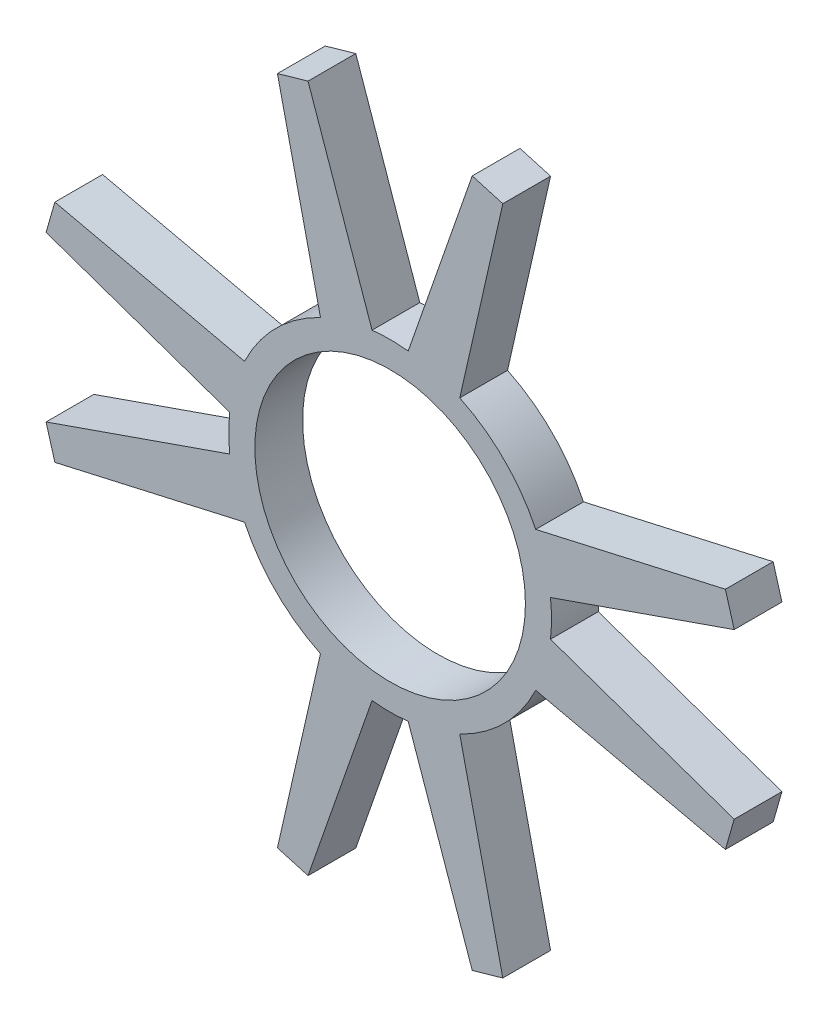
ISO-10303-21;
HEADER;
FILE_DESCRIPTION(('STEP AP214'),'2;1');
FILE_NAME('part.step','',(''),(''),'','','');
FILE_SCHEMA(('AUTOMOTIVE_DESIGN { 1 0 10303 214 1 1 1 1 }'));
ENDSEC;
DATA;
#1=APPLICATION_CONTEXT('core data for automotive mechanical design processes');
#2=APPLICATION_PROTOCOL_DEFINITION('international standard','automotive_design',2000,#1);
#3=PRODUCT_CONTEXT('',#1,'mechanical');
#4=PRODUCT('Part','Part','',(#3));
#5=PRODUCT_RELATED_PRODUCT_CATEGORY('part','',(#4));
#6=PRODUCT_DEFINITION_FORMATION('','',#4);
#7=PRODUCT_DEFINITION_CONTEXT('part definition',#1,'design');
#8=PRODUCT_DEFINITION('design','',#6,#7);
#9=PRODUCT_DEFINITION_SHAPE('','',#8);
#10=(LENGTH_UNIT() NAMED_UNIT(*) SI_UNIT(.MILLI.,.METRE.));
#11=(NAMED_UNIT(*) PLANE_ANGLE_UNIT() SI_UNIT($,.RADIAN.));
#12=(NAMED_UNIT(*) SI_UNIT($,.STERADIAN.) SOLID_ANGLE_UNIT());
#13=UNCERTAINTY_MEASURE_WITH_UNIT(LENGTH_MEASURE(1.E-05),#10,'distance_accuracy_value','');
#14=(GEOMETRIC_REPRESENTATION_CONTEXT(3) GLOBAL_UNCERTAINTY_ASSIGNED_CONTEXT((#13)) GLOBAL_UNIT_ASSIGNED_CONTEXT((#10,
#11,#12)) REPRESENTATION_CONTEXT('',''));
#15=CARTESIAN_POINT('',(0.,0.,0.));
#16=DIRECTION('',(0.,0.,1.));
#17=DIRECTION('',(1.,0.,0.));
#18=AXIS2_PLACEMENT_3D('',#15,#16,#17);
#19=CARTESIAN_POINT('',(0.,0.,3.));
#20=DIRECTION('',(0.,0.,1.));
#21=DIRECTION('',(1.,0.,0.));
#22=AXIS2_PLACEMENT_3D('',#19,#20,#21);
#23=PLANE('',#22);
#24=DIRECTION('',(-0.961261695938316,0.275637355817011,0.));
#25=VECTOR('',#24,1.);
#26=CARTESIAN_POINT('',(7.08036061993367,21.0641966150222,3.));
#27=LINE('',#26,#25);
#28=CARTESIAN_POINT('',(7.08036061993367,21.0641966150222,3.));
#29=VERTEX_POINT('',#28);
#30=CARTESIAN_POINT('',(5.1578372280581,21.6154713266559,3.));
#31=VERTEX_POINT('',#30);
#32=EDGE_CURVE('E338',#29,#31,#27,.T.);
#33=ORIENTED_EDGE('',*,*,#32,.T.);
#34=DIRECTION('',(-0.329121306302809,-0.944287649891458,0.));
#35=VECTOR('',#34,1.);
#36=CARTESIAN_POINT('',(5.1578372280581,21.6154713266559,3.));
#37=LINE('',#36,#35);
#38=CARTESIAN_POINT('',(1.13562590282413,10.0752750314409,3.));
#39=VERTEX_POINT('',#38);
#40=EDGE_CURVE('E166',#31,#39,#37,.T.);
#41=ORIENTED_EDGE('',*,*,#40,.T.);
#42=CARTESIAN_POINT('',(0.,0.,3.));
#43=DIRECTION('',(0.,0.,1.));
#44=DIRECTION('',(1.,0.,0.));
#45=AXIS2_PLACEMENT_3D('',#42,#43,#44);
#46=CIRCLE('',#45,10.1390735844229);
#47=CARTESIAN_POINT('',(-1.13562590282513,10.0752750314408,3.));
#48=VERTEX_POINT('',#47);
#49=EDGE_CURVE('E425',#39,#48,#46,.T.);
#50=ORIENTED_EDGE('',*,*,#49,.T.);
#51=DIRECTION('',(-0.329121306302798,0.944287649891462,0.));
#52=VECTOR('',#51,1.);
#53=CARTESIAN_POINT('',(-5.15783722805877,21.6154713266553,3.));
#54=LINE('',#53,#52);
#55=CARTESIAN_POINT('',(-5.15783722805877,21.6154713266553,3.));
#56=VERTEX_POINT('',#55);
#57=EDGE_CURVE('E444',#48,#56,#54,.T.);
#58=ORIENTED_EDGE('',*,*,#57,.T.);
#59=DIRECTION('',(-0.961261695938309,-0.275637355817034,0.));
#60=VECTOR('',#59,1.);
#61=CARTESIAN_POINT('',(-7.08036061993526,21.0641966150212,3.));
#62=LINE('',#61,#60);
#63=CARTESIAN_POINT('',(-7.08036061993526,21.0641966150212,3.));
#64=VERTEX_POINT('',#63);
#65=EDGE_CURVE('E441',#56,#64,#62,.T.);
#66=ORIENTED_EDGE('',*,*,#65,.T.);
#67=DIRECTION('',(0.221285519440389,-0.975209064193928,0.));
#68=VECTOR('',#67,1.);
#69=CARTESIAN_POINT('',(-7.08036061993526,21.0641966150212,3.));
#70=LINE('',#69,#68);
#71=CARTESIAN_POINT('',(-4.37601694677158,9.14610785153496,3.));
#72=VERTEX_POINT('',#71);
#73=EDGE_CURVE('E443',#64,#72,#70,.T.);
#74=ORIENTED_EDGE('',*,*,#73,.T.);
#75=CARTESIAN_POINT('',(0.,0.,3.));
#76=DIRECTION('',(0.,0.,1.));
#77=DIRECTION('',(1.,0.,0.));
#78=AXIS2_PLACEMENT_3D('',#75,#76,#77);
#79=CIRCLE('',#78,10.1390735844229);
#80=CARTESIAN_POINT('',(-9.14610785153488,4.37601694677174,3.));
#81=VERTEX_POINT('',#80);
#82=EDGE_CURVE('E446',#72,#81,#79,.T.);
#83=ORIENTED_EDGE('',*,*,#82,.T.);
#84=DIRECTION('',(-0.975209064193963,0.221285519440235,0.));
#85=VECTOR('',#84,1.);
#86=CARTESIAN_POINT('',(-21.0641966150222,7.08036061993366,3.));
#87=LINE('',#86,#85);
#88=CARTESIAN_POINT('',(-21.0641966150222,7.08036061993366,3.));
#89=VERTEX_POINT('',#88);
#90=EDGE_CURVE('E452',#81,#89,#87,.T.);
#91=ORIENTED_EDGE('',*,*,#90,.T.);
#92=DIRECTION('',(-0.275637355817011,-0.961261695938316,0.));
#93=VECTOR('',#92,1.);
#94=CARTESIAN_POINT('',(-21.0641966150222,7.08036061993366,3.));
#95=LINE('',#94,#93);
#96=CARTESIAN_POINT('',(-21.6154713266559,5.1578372280581,3.));
#97=VERTEX_POINT('',#96);
#98=EDGE_CURVE('E454',#89,#97,#95,.T.);
#99=ORIENTED_EDGE('',*,*,#98,.T.);
#100=DIRECTION('',(0.944287649891458,-0.329121306302809,0.));
#101=VECTOR('',#100,1.);
#102=CARTESIAN_POINT('',(-21.6154713266559,5.1578372280581,3.));
#103=LINE('',#102,#101);
#104=CARTESIAN_POINT('',(-10.0752750314409,1.13562590282413,3.));
#105=VERTEX_POINT('',#104);
#106=EDGE_CURVE('E456',#97,#105,#103,.T.);
#107=ORIENTED_EDGE('',*,*,#106,.T.);
#108=CARTESIAN_POINT('',(0.,0.,3.));
#109=DIRECTION('',(0.,0.,1.));
#110=DIRECTION('',(1.,0.,0.));
#111=AXIS2_PLACEMENT_3D('',#108,#109,#110);
#112=CIRCLE('',#111,10.1390735844229);
#113=CARTESIAN_POINT('',(-10.0752750314408,-1.13562590282512,3.));
#114=VERTEX_POINT('',#113);
#115=EDGE_CURVE('E458',#105,#114,#112,.T.);
#116=ORIENTED_EDGE('',*,*,#115,.T.);
#117=DIRECTION('',(-0.944287649891462,-0.329121306302799,0.));
#118=VECTOR('',#117,1.);
#119=CARTESIAN_POINT('',(-21.6154713266553,-5.15783722805878,3.));
#120=LINE('',#119,#118);
#121=CARTESIAN_POINT('',(-21.6154713266553,-5.15783722805878,3.));
#122=VERTEX_POINT('',#121);
#123=EDGE_CURVE('E460',#114,#122,#120,.T.);
#124=ORIENTED_EDGE('',*,*,#123,.T.);
#125=DIRECTION('',(0.275637355817138,-0.961261695938279,0.));
#126=VECTOR('',#125,1.);
#127=CARTESIAN_POINT('',(-21.064196615021,-7.08036061993522,3.));
#128=LINE('',#127,#126);
#129=CARTESIAN_POINT('',(-21.064196615021,-7.08036061993522,3.));
#130=VERTEX_POINT('',#129);
#131=EDGE_CURVE('E462',#122,#130,#128,.T.);
#132=ORIENTED_EDGE('',*,*,#131,.T.);
#133=DIRECTION('',(0.975209064193928,0.221285519440388,0.));
#134=VECTOR('',#133,1.);
#135=CARTESIAN_POINT('',(-21.064196615021,-7.08036061993522,3.));
#136=LINE('',#135,#134);
#137=CARTESIAN_POINT('',(-9.14610785153496,-4.37601694677159,3.));
#138=VERTEX_POINT('',#137);
#139=EDGE_CURVE('E464',#130,#138,#136,.T.);
#140=ORIENTED_EDGE('',*,*,#139,.T.);
#141=CARTESIAN_POINT('',(0.,0.,3.));
#142=DIRECTION('',(0.,0.,1.));
#143=DIRECTION('',(1.,0.,0.));
#144=AXIS2_PLACEMENT_3D('',#141,#142,#143);
#145=CIRCLE('',#144,10.1390735844229);
#146=CARTESIAN_POINT('',(-4.37601694677175,-9.14610785153488,3.));
#147=VERTEX_POINT('',#146);
#148=EDGE_CURVE('E466',#138,#147,#145,.T.);
#149=ORIENTED_EDGE('',*,*,#148,.T.);
#150=DIRECTION('',(-0.221285519440235,-0.975209064193963,0.));
#151=VECTOR('',#150,1.);
#152=CARTESIAN_POINT('',(-7.08036061993366,-21.0641966150222,3.));
#153=LINE('',#152,#151);
#154=CARTESIAN_POINT('',(-7.08036061993366,-21.0641966150222,3.));
#155=VERTEX_POINT('',#154);
#156=EDGE_CURVE('E468',#147,#155,#153,.T.);
#157=ORIENTED_EDGE('',*,*,#156,.T.);
#158=DIRECTION('',(0.961261695938316,-0.275637355817011,0.));
#159=VECTOR('',#158,1.);
#160=CARTESIAN_POINT('',(-7.08036061993366,-21.0641966150222,3.));
#161=LINE('',#160,#159);
#162=CARTESIAN_POINT('',(-5.1578372280581,-21.6154713266559,3.));
#163=VERTEX_POINT('',#162);
#164=EDGE_CURVE('E470',#155,#163,#161,.T.);
#165=ORIENTED_EDGE('',*,*,#164,.T.);
#166=DIRECTION('',(0.329121306302809,0.944287649891458,0.));
#167=VECTOR('',#166,1.);
#168=CARTESIAN_POINT('',(-5.1578372280581,-21.6154713266559,3.));
#169=LINE('',#168,#167);
#170=CARTESIAN_POINT('',(-1.13562590282413,-10.0752750314409,3.));
#171=VERTEX_POINT('',#170);
#172=EDGE_CURVE('E472',#163,#171,#169,.T.);
#173=ORIENTED_EDGE('',*,*,#172,.T.);
#174=CARTESIAN_POINT('',(0.,0.,3.));
#175=DIRECTION('',(0.,0.,1.));
#176=DIRECTION('',(1.,0.,0.));
#177=AXIS2_PLACEMENT_3D('',#174,#175,#176);
#178=CIRCLE('',#177,10.1390735844229);
#179=CARTESIAN_POINT('',(1.13562590282512,-10.0752750314408,3.));
#180=VERTEX_POINT('',#179);
#181=EDGE_CURVE('E474',#171,#180,#178,.T.);
#182=ORIENTED_EDGE('',*,*,#181,.T.);
#183=DIRECTION('',(0.329121306302798,-0.944287649891462,0.));
#184=VECTOR('',#183,1.);
#185=CARTESIAN_POINT('',(5.15783722805878,-21.6154713266553,3.));
#186=LINE('',#185,#184);
#187=CARTESIAN_POINT('',(5.15783722805878,-21.6154713266553,3.));
#188=VERTEX_POINT('',#187);
#189=EDGE_CURVE('E476',#180,#188,#186,.T.);
#190=ORIENTED_EDGE('',*,*,#189,.T.);
#191=DIRECTION('',(0.961261695938279,0.275637355817137,0.));
#192=VECTOR('',#191,1.);
#193=CARTESIAN_POINT('',(7.08036061993521,-21.064196615021,3.));
#194=LINE('',#193,#192);
#195=CARTESIAN_POINT('',(7.08036061993521,-21.064196615021,3.));
#196=VERTEX_POINT('',#195);
#197=EDGE_CURVE('E478',#188,#196,#194,.T.);
#198=ORIENTED_EDGE('',*,*,#197,.T.);
#199=DIRECTION('',(-0.221285519440389,0.975209064193928,0.));
#200=VECTOR('',#199,1.);
#201=CARTESIAN_POINT('',(7.08036061993521,-21.064196615021,3.));
#202=LINE('',#201,#200);
#203=CARTESIAN_POINT('',(4.37601694677158,-9.14610785153496,3.));
#204=VERTEX_POINT('',#203);
#205=EDGE_CURVE('E480',#196,#204,#202,.T.);
#206=ORIENTED_EDGE('',*,*,#205,.T.);
#207=CARTESIAN_POINT('',(0.,0.,3.));
#208=DIRECTION('',(0.,0.,1.));
#209=DIRECTION('',(1.,0.,0.));
#210=AXIS2_PLACEMENT_3D('',#207,#208,#209);
#211=CIRCLE('',#210,10.1390735844229);
#212=CARTESIAN_POINT('',(9.14610785153488,-4.37601694677174,3.));
#213=VERTEX_POINT('',#212);
#214=EDGE_CURVE('E482',#204,#213,#211,.T.);
#215=ORIENTED_EDGE('',*,*,#214,.T.);
#216=DIRECTION('',(0.975209064193963,-0.221285519440235,0.));
#217=VECTOR('',#216,1.);
#218=CARTESIAN_POINT('',(21.0641966150222,-7.08036061993367,3.));
#219=LINE('',#218,#217);
#220=CARTESIAN_POINT('',(21.0641966150222,-7.08036061993367,3.));
#221=VERTEX_POINT('',#220);
#222=EDGE_CURVE('E484',#213,#221,#219,.T.);
#223=ORIENTED_EDGE('',*,*,#222,.T.);
#224=DIRECTION('',(0.275637355817011,0.961261695938316,0.));
#225=VECTOR('',#224,1.);
#226=CARTESIAN_POINT('',(21.0641966150222,-7.08036061993367,3.));
#227=LINE('',#226,#225);
#228=CARTESIAN_POINT('',(21.6154713266559,-5.1578372280581,3.));
#229=VERTEX_POINT('',#228);
#230=EDGE_CURVE('E486',#221,#229,#227,.T.);
#231=ORIENTED_EDGE('',*,*,#230,.T.);
#232=DIRECTION('',(-0.944287649891458,0.329121306302809,0.));
#233=VECTOR('',#232,1.);
#234=CARTESIAN_POINT('',(21.6154713266559,-5.1578372280581,3.));
#235=LINE('',#234,#233);
#236=CARTESIAN_POINT('',(10.0752750314409,-1.13562590282413,3.));
#237=VERTEX_POINT('',#236);
#238=EDGE_CURVE('E488',#229,#237,#235,.T.);
#239=ORIENTED_EDGE('',*,*,#238,.T.);
#240=CARTESIAN_POINT('',(0.,0.,3.));
#241=DIRECTION('',(0.,0.,1.));
#242=DIRECTION('',(1.,0.,0.));
#243=AXIS2_PLACEMENT_3D('',#240,#241,#242);
#244=CIRCLE('',#243,10.1390735844229);
#245=CARTESIAN_POINT('',(10.0752750314408,1.13562590282513,3.));
#246=VERTEX_POINT('',#245);
#247=EDGE_CURVE('E490',#237,#246,#244,.T.);
#248=ORIENTED_EDGE('',*,*,#247,.T.);
#249=DIRECTION('',(0.944287649891462,0.329121306302798,0.));
#250=VECTOR('',#249,1.);
#251=CARTESIAN_POINT('',(21.6154713266553,5.15783722805878,3.));
#252=LINE('',#251,#250);
#253=CARTESIAN_POINT('',(21.6154713266553,5.15783722805878,3.));
#254=VERTEX_POINT('',#253);
#255=EDGE_CURVE('E492',#246,#254,#252,.T.);
#256=ORIENTED_EDGE('',*,*,#255,.T.);
#257=DIRECTION('',(-0.275637355817137,0.961261695938279,0.));
#258=VECTOR('',#257,1.);
#259=CARTESIAN_POINT('',(21.064196615021,7.08036061993521,3.));
#260=LINE('',#259,#258);
#261=CARTESIAN_POINT('',(21.064196615021,7.08036061993521,3.));
#262=VERTEX_POINT('',#261);
#263=EDGE_CURVE('E257',#254,#262,#260,.T.);
#264=ORIENTED_EDGE('',*,*,#263,.T.);
#265=DIRECTION('',(-0.975209064193928,-0.221285519440389,0.));
#266=VECTOR('',#265,1.);
#267=CARTESIAN_POINT('',(21.064196615021,7.08036061993521,3.));
#268=LINE('',#267,#266);
#269=CARTESIAN_POINT('',(9.14610785153496,4.37601694677158,3.));
#270=VERTEX_POINT('',#269);
#271=EDGE_CURVE('E251',#262,#270,#268,.T.);
#272=ORIENTED_EDGE('',*,*,#271,.T.);
#273=CARTESIAN_POINT('',(0.,0.,3.));
#274=DIRECTION('',(0.,0.,1.));
#275=DIRECTION('',(1.,0.,0.));
#276=AXIS2_PLACEMENT_3D('',#273,#274,#275);
#277=CIRCLE('',#276,10.1390735844229);
#278=CARTESIAN_POINT('',(4.37601694677174,9.14610785153488,3.));
#279=VERTEX_POINT('',#278);
#280=EDGE_CURVE('E255',#270,#279,#277,.T.);
#281=ORIENTED_EDGE('',*,*,#280,.T.);
#282=DIRECTION('',(0.221285519440235,0.975209064193963,0.));
#283=VECTOR('',#282,1.);
#284=CARTESIAN_POINT('',(7.08036061993367,21.0641966150222,3.));
#285=LINE('',#284,#283);
#286=EDGE_CURVE('E51',#279,#29,#285,.T.);
#287=ORIENTED_EDGE('',*,*,#286,.T.);
#288=EDGE_LOOP('',(#33,#41,#50,#58,#66,#74,#83,#91,#99,#107,#116,#124,#132,#140,#149,#157,#165,
#173,#182,#190,#198,#206,#215,#223,#231,#239,#248,#256,#264,#272,#281,#287));
#289=FACE_BOUND('',#288,.T.);
#290=CARTESIAN_POINT('',(0.,0.,3.));
#291=DIRECTION('',(0.,0.,1.));
#292=DIRECTION('',(1.,0.,0.));
#293=AXIS2_PLACEMENT_3D('',#290,#291,#292);
#294=CIRCLE('',#293,8.5);
#295=CARTESIAN_POINT('',(8.5,0.,3.));
#296=VERTEX_POINT('',#295);
#297=EDGE_CURVE('E279',#296,#296,#294,.T.);
#298=ORIENTED_EDGE('',*,*,#297,.F.);
#299=EDGE_LOOP('',(#298));
#300=FACE_BOUND('',#299,.T.);
#301=ADVANCED_FACE('F34',(#289,#300),#23,.T.);
#302=CARTESIAN_POINT('',(0.,0.,0.));
#303=DIRECTION('',(0.,0.,1.));
#304=DIRECTION('',(1.,0.,0.));
#305=AXIS2_PLACEMENT_3D('',#302,#303,#304);
#306=PLANE('',#305);
#307=DIRECTION('',(-0.961261695938316,0.275637355817011,0.));
#308=VECTOR('',#307,1.);
#309=CARTESIAN_POINT('',(7.08036061993367,21.0641966150222,0.));
#310=LINE('',#309,#308);
#311=CARTESIAN_POINT('',(7.08036061993367,21.0641966150222,0.));
#312=VERTEX_POINT('',#311);
#313=CARTESIAN_POINT('',(5.1578372280581,21.6154713266559,0.));
#314=VERTEX_POINT('',#313);
#315=EDGE_CURVE('E275',#312,#314,#310,.T.);
#316=ORIENTED_EDGE('',*,*,#315,.F.);
#317=DIRECTION('',(0.221285519440235,0.975209064193963,0.));
#318=VECTOR('',#317,1.);
#319=CARTESIAN_POINT('',(7.08036061993367,21.0641966150222,0.));
#320=LINE('',#319,#318);
#321=CARTESIAN_POINT('',(4.37601694677174,9.14610785153488,0.));
#322=VERTEX_POINT('',#321);
#323=EDGE_CURVE('E158',#322,#312,#320,.T.);
#324=ORIENTED_EDGE('',*,*,#323,.F.);
#325=CARTESIAN_POINT('',(0.,0.,0.));
#326=DIRECTION('',(0.,0.,1.));
#327=DIRECTION('',(1.,0.,0.));
#328=AXIS2_PLACEMENT_3D('',#325,#326,#327);
#329=CIRCLE('',#328,10.1390735844229);
#330=CARTESIAN_POINT('',(9.14610785153496,4.37601694677158,0.));
#331=VERTEX_POINT('',#330);
#332=EDGE_CURVE('E152',#331,#322,#329,.T.);
#333=ORIENTED_EDGE('',*,*,#332,.F.);
#334=DIRECTION('',(-0.975209064193928,-0.221285519440389,0.));
#335=VECTOR('',#334,1.);
#336=CARTESIAN_POINT('',(21.064196615021,7.08036061993521,0.));
#337=LINE('',#336,#335);
#338=CARTESIAN_POINT('',(21.064196615021,7.08036061993521,0.));
#339=VERTEX_POINT('',#338);
#340=EDGE_CURVE('E265',#339,#331,#337,.T.);
#341=ORIENTED_EDGE('',*,*,#340,.F.);
#342=DIRECTION('',(-0.275637355817137,0.961261695938279,0.));
#343=VECTOR('',#342,1.);
#344=CARTESIAN_POINT('',(21.064196615021,7.08036061993521,0.));
#345=LINE('',#344,#343);
#346=CARTESIAN_POINT('',(21.6154713266553,5.15783722805878,0.));
#347=VERTEX_POINT('',#346);
#348=EDGE_CURVE('E333',#347,#339,#345,.T.);
#349=ORIENTED_EDGE('',*,*,#348,.F.);
#350=DIRECTION('',(0.944287649891462,0.329121306302798,0.));
#351=VECTOR('',#350,1.);
#352=CARTESIAN_POINT('',(21.6154713266553,5.15783722805878,0.));
#353=LINE('',#352,#351);
#354=CARTESIAN_POINT('',(10.0752750314408,1.13562590282513,0.));
#355=VERTEX_POINT('',#354);
#356=EDGE_CURVE('E331',#355,#347,#353,.T.);
#357=ORIENTED_EDGE('',*,*,#356,.F.);
#358=CARTESIAN_POINT('',(0.,0.,0.));
#359=DIRECTION('',(0.,0.,1.));
#360=DIRECTION('',(1.,0.,0.));
#361=AXIS2_PLACEMENT_3D('',#358,#359,#360);
#362=CIRCLE('',#361,10.1390735844229);
#363=CARTESIAN_POINT('',(10.0752750314409,-1.13562590282413,0.));
#364=VERTEX_POINT('',#363);
#365=EDGE_CURVE('E329',#364,#355,#362,.T.);
#366=ORIENTED_EDGE('',*,*,#365,.F.);
#367=DIRECTION('',(-0.944287649891458,0.329121306302809,0.));
#368=VECTOR('',#367,1.);
#369=CARTESIAN_POINT('',(21.6154713266559,-5.1578372280581,0.));
#370=LINE('',#369,#368);
#371=CARTESIAN_POINT('',(21.6154713266559,-5.1578372280581,0.));
#372=VERTEX_POINT('',#371);
#373=EDGE_CURVE('E327',#372,#364,#370,.T.);
#374=ORIENTED_EDGE('',*,*,#373,.F.);
#375=DIRECTION('',(0.275637355817011,0.961261695938316,0.));
#376=VECTOR('',#375,1.);
#377=CARTESIAN_POINT('',(21.0641966150222,-7.08036061993367,0.));
#378=LINE('',#377,#376);
#379=CARTESIAN_POINT('',(21.0641966150222,-7.08036061993367,0.));
#380=VERTEX_POINT('',#379);
#381=EDGE_CURVE('E325',#380,#372,#378,.T.);
#382=ORIENTED_EDGE('',*,*,#381,.F.);
#383=DIRECTION('',(0.975209064193963,-0.221285519440235,0.));
#384=VECTOR('',#383,1.);
#385=CARTESIAN_POINT('',(21.0641966150222,-7.08036061993367,0.));
#386=LINE('',#385,#384);
#387=CARTESIAN_POINT('',(9.14610785153488,-4.37601694677174,0.));
#388=VERTEX_POINT('',#387);
#389=EDGE_CURVE('E323',#388,#380,#386,.T.);
#390=ORIENTED_EDGE('',*,*,#389,.F.);
#391=CARTESIAN_POINT('',(0.,0.,0.));
#392=DIRECTION('',(0.,0.,1.));
#393=DIRECTION('',(1.,0.,0.));
#394=AXIS2_PLACEMENT_3D('',#391,#392,#393);
#395=CIRCLE('',#394,10.1390735844229);
#396=CARTESIAN_POINT('',(4.37601694677158,-9.14610785153496,0.));
#397=VERTEX_POINT('',#396);
#398=EDGE_CURVE('E321',#397,#388,#395,.T.);
#399=ORIENTED_EDGE('',*,*,#398,.F.);
#400=DIRECTION('',(-0.221285519440389,0.975209064193928,0.));
#401=VECTOR('',#400,1.);
#402=CARTESIAN_POINT('',(7.08036061993521,-21.064196615021,0.));
#403=LINE('',#402,#401);
#404=CARTESIAN_POINT('',(7.08036061993521,-21.064196615021,0.));
#405=VERTEX_POINT('',#404);
#406=EDGE_CURVE('E319',#405,#397,#403,.T.);
#407=ORIENTED_EDGE('',*,*,#406,.F.);
#408=DIRECTION('',(0.961261695938279,0.275637355817137,0.));
#409=VECTOR('',#408,1.);
#410=CARTESIAN_POINT('',(7.08036061993521,-21.064196615021,0.));
#411=LINE('',#410,#409);
#412=CARTESIAN_POINT('',(5.15783722805878,-21.6154713266553,0.));
#413=VERTEX_POINT('',#412);
#414=EDGE_CURVE('E317',#413,#405,#411,.T.);
#415=ORIENTED_EDGE('',*,*,#414,.F.);
#416=DIRECTION('',(0.329121306302798,-0.944287649891462,0.));
#417=VECTOR('',#416,1.);
#418=CARTESIAN_POINT('',(5.15783722805878,-21.6154713266553,0.));
#419=LINE('',#418,#417);
#420=CARTESIAN_POINT('',(1.13562590282512,-10.0752750314408,0.));
#421=VERTEX_POINT('',#420);
#422=EDGE_CURVE('E315',#421,#413,#419,.T.);
#423=ORIENTED_EDGE('',*,*,#422,.F.);
#424=CARTESIAN_POINT('',(0.,0.,0.));
#425=DIRECTION('',(0.,0.,1.));
#426=DIRECTION('',(1.,0.,0.));
#427=AXIS2_PLACEMENT_3D('',#424,#425,#426);
#428=CIRCLE('',#427,10.1390735844229);
#429=CARTESIAN_POINT('',(-1.13562590282413,-10.0752750314409,0.));
#430=VERTEX_POINT('',#429);
#431=EDGE_CURVE('E313',#430,#421,#428,.T.);
#432=ORIENTED_EDGE('',*,*,#431,.F.);
#433=DIRECTION('',(0.329121306302809,0.944287649891458,0.));
#434=VECTOR('',#433,1.);
#435=CARTESIAN_POINT('',(-5.1578372280581,-21.6154713266559,0.));
#436=LINE('',#435,#434);
#437=CARTESIAN_POINT('',(-5.1578372280581,-21.6154713266559,0.));
#438=VERTEX_POINT('',#437);
#439=EDGE_CURVE('E311',#438,#430,#436,.T.);
#440=ORIENTED_EDGE('',*,*,#439,.F.);
#441=DIRECTION('',(0.961261695938316,-0.275637355817011,0.));
#442=VECTOR('',#441,1.);
#443=CARTESIAN_POINT('',(-7.08036061993366,-21.0641966150222,0.));
#444=LINE('',#443,#442);
#445=CARTESIAN_POINT('',(-7.08036061993366,-21.0641966150222,0.));
#446=VERTEX_POINT('',#445);
#447=EDGE_CURVE('E309',#446,#438,#444,.T.);
#448=ORIENTED_EDGE('',*,*,#447,.F.);
#449=DIRECTION('',(-0.221285519440235,-0.975209064193963,0.));
#450=VECTOR('',#449,1.);
#451=CARTESIAN_POINT('',(-7.08036061993366,-21.0641966150222,0.));
#452=LINE('',#451,#450);
#453=CARTESIAN_POINT('',(-4.37601694677175,-9.14610785153488,0.));
#454=VERTEX_POINT('',#453);
#455=EDGE_CURVE('E307',#454,#446,#452,.T.);
#456=ORIENTED_EDGE('',*,*,#455,.F.);
#457=CARTESIAN_POINT('',(0.,0.,0.));
#458=DIRECTION('',(0.,0.,1.));
#459=DIRECTION('',(1.,0.,0.));
#460=AXIS2_PLACEMENT_3D('',#457,#458,#459);
#461=CIRCLE('',#460,10.1390735844229);
#462=CARTESIAN_POINT('',(-9.14610785153496,-4.37601694677159,0.));
#463=VERTEX_POINT('',#462);
#464=EDGE_CURVE('E305',#463,#454,#461,.T.);
#465=ORIENTED_EDGE('',*,*,#464,.F.);
#466=DIRECTION('',(0.975209064193928,0.221285519440388,0.));
#467=VECTOR('',#466,1.);
#468=CARTESIAN_POINT('',(-21.064196615021,-7.08036061993522,0.));
#469=LINE('',#468,#467);
#470=CARTESIAN_POINT('',(-21.064196615021,-7.08036061993522,0.));
#471=VERTEX_POINT('',#470);
#472=EDGE_CURVE('E303',#471,#463,#469,.T.);
#473=ORIENTED_EDGE('',*,*,#472,.F.);
#474=DIRECTION('',(0.275637355817138,-0.961261695938279,0.));
#475=VECTOR('',#474,1.);
#476=CARTESIAN_POINT('',(-21.064196615021,-7.08036061993522,0.));
#477=LINE('',#476,#475);
#478=CARTESIAN_POINT('',(-21.6154713266553,-5.15783722805878,0.));
#479=VERTEX_POINT('',#478);
#480=EDGE_CURVE('E301',#479,#471,#477,.T.);
#481=ORIENTED_EDGE('',*,*,#480,.F.);
#482=DIRECTION('',(-0.944287649891462,-0.329121306302799,0.));
#483=VECTOR('',#482,1.);
#484=CARTESIAN_POINT('',(-21.6154713266553,-5.15783722805878,0.));
#485=LINE('',#484,#483);
#486=CARTESIAN_POINT('',(-10.0752750314408,-1.13562590282512,0.));
#487=VERTEX_POINT('',#486);
#488=EDGE_CURVE('E299',#487,#479,#485,.T.);
#489=ORIENTED_EDGE('',*,*,#488,.F.);
#490=CARTESIAN_POINT('',(0.,0.,0.));
#491=DIRECTION('',(0.,0.,1.));
#492=DIRECTION('',(1.,0.,0.));
#493=AXIS2_PLACEMENT_3D('',#490,#491,#492);
#494=CIRCLE('',#493,10.1390735844229);
#495=CARTESIAN_POINT('',(-10.0752750314409,1.13562590282413,0.));
#496=VERTEX_POINT('',#495);
#497=EDGE_CURVE('E297',#496,#487,#494,.T.);
#498=ORIENTED_EDGE('',*,*,#497,.F.);
#499=DIRECTION('',(0.944287649891458,-0.329121306302809,0.));
#500=VECTOR('',#499,1.);
#501=CARTESIAN_POINT('',(-21.6154713266559,5.1578372280581,0.));
#502=LINE('',#501,#500);
#503=CARTESIAN_POINT('',(-21.6154713266559,5.1578372280581,0.));
#504=VERTEX_POINT('',#503);
#505=EDGE_CURVE('E295',#504,#496,#502,.T.);
#506=ORIENTED_EDGE('',*,*,#505,.F.);
#507=DIRECTION('',(-0.275637355817011,-0.961261695938316,0.));
#508=VECTOR('',#507,1.);
#509=CARTESIAN_POINT('',(-21.0641966150222,7.08036061993366,0.));
#510=LINE('',#509,#508);
#511=CARTESIAN_POINT('',(-21.0641966150222,7.08036061993366,0.));
#512=VERTEX_POINT('',#511);
#513=EDGE_CURVE('E293',#512,#504,#510,.T.);
#514=ORIENTED_EDGE('',*,*,#513,.F.);
#515=DIRECTION('',(-0.975209064193963,0.221285519440235,0.));
#516=VECTOR('',#515,1.);
#517=CARTESIAN_POINT('',(-21.0641966150222,7.08036061993366,0.));
#518=LINE('',#517,#516);
#519=CARTESIAN_POINT('',(-9.14610785153488,4.37601694677174,0.));
#520=VERTEX_POINT('',#519);
#521=EDGE_CURVE('E291',#520,#512,#518,.T.);
#522=ORIENTED_EDGE('',*,*,#521,.F.);
#523=CARTESIAN_POINT('',(0.,0.,0.));
#524=DIRECTION('',(0.,0.,1.));
#525=DIRECTION('',(1.,0.,0.));
#526=AXIS2_PLACEMENT_3D('',#523,#524,#525);
#527=CIRCLE('',#526,10.1390735844229);
#528=CARTESIAN_POINT('',(-4.37601694677158,9.14610785153496,0.));
#529=VERTEX_POINT('',#528);
#530=EDGE_CURVE('E289',#529,#520,#527,.T.);
#531=ORIENTED_EDGE('',*,*,#530,.F.);
#532=DIRECTION('',(0.221285519440389,-0.975209064193928,0.));
#533=VECTOR('',#532,1.);
#534=CARTESIAN_POINT('',(-7.08036061993526,21.0641966150212,0.));
#535=LINE('',#534,#533);
#536=CARTESIAN_POINT('',(-7.08036061993526,21.0641966150212,0.));
#537=VERTEX_POINT('',#536);
#538=EDGE_CURVE('E287',#537,#529,#535,.T.);
#539=ORIENTED_EDGE('',*,*,#538,.F.);
#540=DIRECTION('',(-0.961261695938309,-0.275637355817034,0.));
#541=VECTOR('',#540,1.);
#542=CARTESIAN_POINT('',(-7.08036061993526,21.0641966150212,0.));
#543=LINE('',#542,#541);
#544=CARTESIAN_POINT('',(-5.15783722805877,21.6154713266553,0.));
#545=VERTEX_POINT('',#544);
#546=EDGE_CURVE('E285',#545,#537,#543,.T.);
#547=ORIENTED_EDGE('',*,*,#546,.F.);
#548=DIRECTION('',(-0.329121306302798,0.944287649891462,0.));
#549=VECTOR('',#548,1.);
#550=CARTESIAN_POINT('',(-5.15783722805877,21.6154713266553,0.));
#551=LINE('',#550,#549);
#552=CARTESIAN_POINT('',(-1.13562590282513,10.0752750314408,0.));
#553=VERTEX_POINT('',#552);
#554=EDGE_CURVE('E283',#553,#545,#551,.T.);
#555=ORIENTED_EDGE('',*,*,#554,.F.);
#556=CARTESIAN_POINT('',(0.,0.,0.));
#557=DIRECTION('',(0.,0.,1.));
#558=DIRECTION('',(1.,0.,0.));
#559=AXIS2_PLACEMENT_3D('',#556,#557,#558);
#560=CIRCLE('',#559,10.1390735844229);
#561=CARTESIAN_POINT('',(1.13562590282413,10.0752750314409,0.));
#562=VERTEX_POINT('',#561);
#563=EDGE_CURVE('E281',#562,#553,#560,.T.);
#564=ORIENTED_EDGE('',*,*,#563,.F.);
#565=DIRECTION('',(-0.329121306302809,-0.944287649891458,0.));
#566=VECTOR('',#565,1.);
#567=CARTESIAN_POINT('',(5.1578372280581,21.6154713266559,0.));
#568=LINE('',#567,#566);
#569=EDGE_CURVE('E278',#314,#562,#568,.T.);
#570=ORIENTED_EDGE('',*,*,#569,.F.);
#571=EDGE_LOOP('',(#316,#324,#333,#341,#349,#357,#366,#374,#382,#390,#399,#407,#415,#423,#432,
#440,#448,#456,#465,#473,#481,#489,#498,#506,#514,#522,#531,#539,#547,#555,#564,#570));
#572=FACE_BOUND('',#571,.T.);
#573=CARTESIAN_POINT('',(0.,0.,0.));
#574=DIRECTION('',(0.,0.,1.));
#575=DIRECTION('',(1.,0.,0.));
#576=AXIS2_PLACEMENT_3D('',#573,#574,#575);
#577=CIRCLE('',#576,8.5);
#578=CARTESIAN_POINT('',(8.5,0.,0.));
#579=VERTEX_POINT('',#578);
#580=EDGE_CURVE('E899',#579,#579,#577,.T.);
#581=ORIENTED_EDGE('',*,*,#580,.T.);
#582=EDGE_LOOP('',(#581));
#583=FACE_BOUND('',#582,.T.);
#584=ADVANCED_FACE('F429',(#572,#583),#306,.F.);
#585=CARTESIAN_POINT('',(7.08036061993367,21.0641966150222,3.));
#586=DIRECTION('',(-0.275637355817011,-0.961261695938315,0.));
#587=DIRECTION('',(0.961261695938316,-0.275637355817011,0.));
#588=AXIS2_PLACEMENT_3D('',#585,#586,#587);
#589=PLANE('',#588);
#590=ORIENTED_EDGE('',*,*,#315,.T.);
#591=DIRECTION('',(0.,0.,-1.));
#592=VECTOR('',#591,1.);
#593=CARTESIAN_POINT('',(5.1578372280581,21.6154713266559,3.));
#594=LINE('',#593,#592);
#595=EDGE_CURVE('E11',#31,#314,#594,.T.);
#596=ORIENTED_EDGE('',*,*,#595,.F.);
#597=ORIENTED_EDGE('',*,*,#32,.F.);
#598=DIRECTION('',(0.,0.,-1.));
#599=VECTOR('',#598,1.);
#600=CARTESIAN_POINT('',(7.08036061993367,21.0641966150222,3.));
#601=LINE('',#600,#599);
#602=EDGE_CURVE('E271',#29,#312,#601,.T.);
#603=ORIENTED_EDGE('',*,*,#602,.T.);
#604=EDGE_LOOP('',(#590,#596,#597,#603));
#605=FACE_BOUND('',#604,.T.);
#606=ADVANCED_FACE('F36',(#605),#589,.F.);
#607=CARTESIAN_POINT('',(5.1578372280581,21.6154713266559,3.));
#608=DIRECTION('',(0.944287649891458,-0.329121306302809,0.));
#609=DIRECTION('',(0.329121306302809,0.944287649891458,0.));
#610=AXIS2_PLACEMENT_3D('',#607,#608,#609);
#611=PLANE('',#610);
#612=ORIENTED_EDGE('',*,*,#569,.T.);
#613=DIRECTION('',(0.,0.,-1.));
#614=VECTOR('',#613,1.);
#615=CARTESIAN_POINT('',(1.13562590282413,10.0752750314409,3.));
#616=LINE('',#615,#614);
#617=EDGE_CURVE('E43',#39,#562,#616,.T.);
#618=ORIENTED_EDGE('',*,*,#617,.F.);
#619=ORIENTED_EDGE('',*,*,#40,.F.);
#620=ORIENTED_EDGE('',*,*,#595,.T.);
#621=EDGE_LOOP('',(#612,#618,#619,#620));
#622=FACE_BOUND('',#621,.T.);
#623=ADVANCED_FACE('F526',(#622),#611,.F.);
#624=CARTESIAN_POINT('',(0.,0.,3.));
#625=DIRECTION('',(0.,0.,-1.));
#626=DIRECTION('',(-1.,0.,0.));
#627=AXIS2_PLACEMENT_3D('',#624,#625,#626);
#628=CYLINDRICAL_SURFACE('',#627,10.1390735844229);
#629=ORIENTED_EDGE('',*,*,#563,.T.);
#630=DIRECTION('',(0.,0.,-1.));
#631=VECTOR('',#630,1.);
#632=CARTESIAN_POINT('',(-1.13562590282513,10.0752750314408,3.));
#633=LINE('',#632,#631);
#634=EDGE_CURVE('E417',#48,#553,#633,.T.);
#635=ORIENTED_EDGE('',*,*,#634,.F.);
#636=ORIENTED_EDGE('',*,*,#49,.F.);
#637=ORIENTED_EDGE('',*,*,#617,.T.);
#638=EDGE_LOOP('',(#629,#635,#636,#637));
#639=FACE_BOUND('',#638,.T.);
#640=ADVANCED_FACE('F423',(#639),#628,.T.);
#641=CARTESIAN_POINT('',(-5.15783722805877,21.6154713266553,3.));
#642=DIRECTION('',(-0.944287649891462,-0.329121306302798,0.));
#643=DIRECTION('',(0.329121306302798,-0.944287649891462,0.));
#644=AXIS2_PLACEMENT_3D('',#641,#642,#643);
#645=PLANE('',#644);
#646=ORIENTED_EDGE('',*,*,#554,.T.);
#647=DIRECTION('',(0.,0.,-1.));
#648=VECTOR('',#647,1.);
#649=CARTESIAN_POINT('',(-5.15783722805877,21.6154713266553,3.));
#650=LINE('',#649,#648);
#651=EDGE_CURVE('E414',#56,#545,#650,.T.);
#652=ORIENTED_EDGE('',*,*,#651,.F.);
#653=ORIENTED_EDGE('',*,*,#57,.F.);
#654=ORIENTED_EDGE('',*,*,#634,.T.);
#655=EDGE_LOOP('',(#646,#652,#653,#654));
#656=FACE_BOUND('',#655,.T.);
#657=ADVANCED_FACE('F435',(#656),#645,.F.);
#658=CARTESIAN_POINT('',(-7.08036061993526,21.0641966150212,3.));
#659=DIRECTION('',(0.275637355817034,-0.961261695938309,0.));
#660=DIRECTION('',(0.961261695938309,0.275637355817034,0.));
#661=AXIS2_PLACEMENT_3D('',#658,#659,#660);
#662=PLANE('',#661);
#663=ORIENTED_EDGE('',*,*,#546,.T.);
#664=DIRECTION('',(0.,0.,-1.));
#665=VECTOR('',#664,1.);
#666=CARTESIAN_POINT('',(-7.08036061993526,21.0641966150212,3.));
#667=LINE('',#666,#665);
#668=EDGE_CURVE('E411',#64,#537,#667,.T.);
#669=ORIENTED_EDGE('',*,*,#668,.F.);
#670=ORIENTED_EDGE('',*,*,#65,.F.);
#671=ORIENTED_EDGE('',*,*,#651,.T.);
#672=EDGE_LOOP('',(#663,#669,#670,#671));
#673=FACE_BOUND('',#672,.T.);
#674=ADVANCED_FACE('F439',(#673),#662,.F.);
#675=CARTESIAN_POINT('',(-7.08036061993526,21.0641966150212,3.));
#676=DIRECTION('',(0.975209064193928,0.221285519440389,0.));
#677=DIRECTION('',(-0.221285519440389,0.975209064193928,0.));
#678=AXIS2_PLACEMENT_3D('',#675,#676,#677);
#679=PLANE('',#678);
#680=ORIENTED_EDGE('',*,*,#538,.T.);
#681=DIRECTION('',(0.,0.,-1.));
#682=VECTOR('',#681,1.);
#683=CARTESIAN_POINT('',(-4.37601694677158,9.14610785153496,3.));
#684=LINE('',#683,#682);
#685=EDGE_CURVE('E408',#72,#529,#684,.T.);
#686=ORIENTED_EDGE('',*,*,#685,.F.);
#687=ORIENTED_EDGE('',*,*,#73,.F.);
#688=ORIENTED_EDGE('',*,*,#668,.T.);
#689=EDGE_LOOP('',(#680,#686,#687,#688));
#690=FACE_BOUND('',#689,.T.);
#691=ADVANCED_FACE('F539',(#690),#679,.F.);
#692=CARTESIAN_POINT('',(0.,0.,3.));
#693=DIRECTION('',(0.,0.,-1.));
#694=DIRECTION('',(-1.,0.,0.));
#695=AXIS2_PLACEMENT_3D('',#692,#693,#694);
#696=CYLINDRICAL_SURFACE('',#695,10.1390735844229);
#697=ORIENTED_EDGE('',*,*,#530,.T.);
#698=DIRECTION('',(0.,0.,-1.));
#699=VECTOR('',#698,1.);
#700=CARTESIAN_POINT('',(-9.14610785153488,4.37601694677174,3.));
#701=LINE('',#700,#699);
#702=EDGE_CURVE('E405',#81,#520,#701,.T.);
#703=ORIENTED_EDGE('',*,*,#702,.F.);
#704=ORIENTED_EDGE('',*,*,#82,.F.);
#705=ORIENTED_EDGE('',*,*,#685,.T.);
#706=EDGE_LOOP('',(#697,#703,#704,#705));
#707=FACE_BOUND('',#706,.T.);
#708=ADVANCED_FACE('F542',(#707),#696,.T.);
#709=CARTESIAN_POINT('',(-21.0641966150222,7.08036061993366,3.));
#710=DIRECTION('',(-0.221285519440234,-0.975209064193963,0.));
#711=DIRECTION('',(0.975209064193963,-0.221285519440234,0.));
#712=AXIS2_PLACEMENT_3D('',#709,#710,#711);
#713=PLANE('',#712);
#714=ORIENTED_EDGE('',*,*,#521,.T.);
#715=DIRECTION('',(0.,0.,-1.));
#716=VECTOR('',#715,1.);
#717=CARTESIAN_POINT('',(-21.0641966150222,7.08036061993366,3.));
#718=LINE('',#717,#716);
#719=EDGE_CURVE('E402',#89,#512,#718,.T.);
#720=ORIENTED_EDGE('',*,*,#719,.F.);
#721=ORIENTED_EDGE('',*,*,#90,.F.);
#722=ORIENTED_EDGE('',*,*,#702,.T.);
#723=EDGE_LOOP('',(#714,#720,#721,#722));
#724=FACE_BOUND('',#723,.T.);
#725=ADVANCED_FACE('F546',(#724),#713,.F.);
#726=CARTESIAN_POINT('',(-21.0641966150222,7.08036061993366,3.));
#727=DIRECTION('',(0.961261695938315,-0.275637355817011,0.));
#728=DIRECTION('',(0.275637355817011,0.961261695938316,0.));
#729=AXIS2_PLACEMENT_3D('',#726,#727,#728);
#730=PLANE('',#729);
#731=ORIENTED_EDGE('',*,*,#513,.T.);
#732=DIRECTION('',(0.,0.,-1.));
#733=VECTOR('',#732,1.);
#734=CARTESIAN_POINT('',(-21.6154713266559,5.1578372280581,3.));
#735=LINE('',#734,#733);
#736=EDGE_CURVE('E399',#97,#504,#735,.T.);
#737=ORIENTED_EDGE('',*,*,#736,.F.);
#738=ORIENTED_EDGE('',*,*,#98,.F.);
#739=ORIENTED_EDGE('',*,*,#719,.T.);
#740=EDGE_LOOP('',(#731,#737,#738,#739));
#741=FACE_BOUND('',#740,.T.);
#742=ADVANCED_FACE('F550',(#741),#730,.F.);
#743=CARTESIAN_POINT('',(-21.6154713266559,5.1578372280581,3.));
#744=DIRECTION('',(0.329121306302809,0.944287649891458,0.));
#745=DIRECTION('',(-0.944287649891458,0.329121306302809,0.));
#746=AXIS2_PLACEMENT_3D('',#743,#744,#745);
#747=PLANE('',#746);
#748=ORIENTED_EDGE('',*,*,#505,.T.);
#749=DIRECTION('',(0.,0.,-1.));
#750=VECTOR('',#749,1.);
#751=CARTESIAN_POINT('',(-10.0752750314409,1.13562590282413,3.));
#752=LINE('',#751,#750);
#753=EDGE_CURVE('E396',#105,#496,#752,.T.);
#754=ORIENTED_EDGE('',*,*,#753,.F.);
#755=ORIENTED_EDGE('',*,*,#106,.F.);
#756=ORIENTED_EDGE('',*,*,#736,.T.);
#757=EDGE_LOOP('',(#748,#754,#755,#756));
#758=FACE_BOUND('',#757,.T.);
#759=ADVANCED_FACE('F554',(#758),#747,.F.);
#760=CARTESIAN_POINT('',(0.,0.,3.));
#761=DIRECTION('',(0.,0.,-1.));
#762=DIRECTION('',(-1.,0.,0.));
#763=AXIS2_PLACEMENT_3D('',#760,#761,#762);
#764=CYLINDRICAL_SURFACE('',#763,10.1390735844229);
#765=ORIENTED_EDGE('',*,*,#497,.T.);
#766=DIRECTION('',(0.,0.,-1.));
#767=VECTOR('',#766,1.);
#768=CARTESIAN_POINT('',(-10.0752750314408,-1.13562590282512,3.));
#769=LINE('',#768,#767);
#770=EDGE_CURVE('E393',#114,#487,#769,.T.);
#771=ORIENTED_EDGE('',*,*,#770,.F.);
#772=ORIENTED_EDGE('',*,*,#115,.F.);
#773=ORIENTED_EDGE('',*,*,#753,.T.);
#774=EDGE_LOOP('',(#765,#771,#772,#773));
#775=FACE_BOUND('',#774,.T.);
#776=ADVANCED_FACE('F558',(#775),#764,.T.);
#777=CARTESIAN_POINT('',(-21.6154713266553,-5.15783722805878,3.));
#778=DIRECTION('',(0.329121306302799,-0.944287649891461,0.));
#779=DIRECTION('',(0.944287649891462,0.329121306302799,0.));
#780=AXIS2_PLACEMENT_3D('',#777,#778,#779);
#781=PLANE('',#780);
#782=ORIENTED_EDGE('',*,*,#488,.T.);
#783=DIRECTION('',(0.,0.,-1.));
#784=VECTOR('',#783,1.);
#785=CARTESIAN_POINT('',(-21.6154713266553,-5.15783722805878,3.));
#786=LINE('',#785,#784);
#787=EDGE_CURVE('E390',#122,#479,#786,.T.);
#788=ORIENTED_EDGE('',*,*,#787,.F.);
#789=ORIENTED_EDGE('',*,*,#123,.F.);
#790=ORIENTED_EDGE('',*,*,#770,.T.);
#791=EDGE_LOOP('',(#782,#788,#789,#790));
#792=FACE_BOUND('',#791,.T.);
#793=ADVANCED_FACE('F562',(#792),#781,.F.);
#794=CARTESIAN_POINT('',(-21.064196615021,-7.08036061993522,3.));
#795=DIRECTION('',(0.961261695938279,0.275637355817138,0.));
#796=DIRECTION('',(-0.275637355817138,0.961261695938279,0.));
#797=AXIS2_PLACEMENT_3D('',#794,#795,#796);
#798=PLANE('',#797);
#799=ORIENTED_EDGE('',*,*,#480,.T.);
#800=DIRECTION('',(0.,0.,-1.));
#801=VECTOR('',#800,1.);
#802=CARTESIAN_POINT('',(-21.064196615021,-7.08036061993522,3.));
#803=LINE('',#802,#801);
#804=EDGE_CURVE('E387',#130,#471,#803,.T.);
#805=ORIENTED_EDGE('',*,*,#804,.F.);
#806=ORIENTED_EDGE('',*,*,#131,.F.);
#807=ORIENTED_EDGE('',*,*,#787,.T.);
#808=EDGE_LOOP('',(#799,#805,#806,#807));
#809=FACE_BOUND('',#808,.T.);
#810=ADVANCED_FACE('F566',(#809),#798,.F.);
#811=CARTESIAN_POINT('',(-21.064196615021,-7.08036061993522,3.));
#812=DIRECTION('',(-0.221285519440388,0.975209064193928,0.));
#813=DIRECTION('',(-0.975209064193928,-0.221285519440388,0.));
#814=AXIS2_PLACEMENT_3D('',#811,#812,#813);
#815=PLANE('',#814);
#816=ORIENTED_EDGE('',*,*,#472,.T.);
#817=DIRECTION('',(0.,0.,-1.));
#818=VECTOR('',#817,1.);
#819=CARTESIAN_POINT('',(-9.14610785153496,-4.37601694677159,3.));
#820=LINE('',#819,#818);
#821=EDGE_CURVE('E384',#138,#463,#820,.T.);
#822=ORIENTED_EDGE('',*,*,#821,.F.);
#823=ORIENTED_EDGE('',*,*,#139,.F.);
#824=ORIENTED_EDGE('',*,*,#804,.T.);
#825=EDGE_LOOP('',(#816,#822,#823,#824));
#826=FACE_BOUND('',#825,.T.);
#827=ADVANCED_FACE('F570',(#826),#815,.F.);
#828=CARTESIAN_POINT('',(0.,0.,3.));
#829=DIRECTION('',(0.,0.,-1.));
#830=DIRECTION('',(-1.,0.,0.));
#831=AXIS2_PLACEMENT_3D('',#828,#829,#830);
#832=CYLINDRICAL_SURFACE('',#831,10.1390735844229);
#833=ORIENTED_EDGE('',*,*,#464,.T.);
#834=DIRECTION('',(0.,0.,-1.));
#835=VECTOR('',#834,1.);
#836=CARTESIAN_POINT('',(-4.37601694677175,-9.14610785153488,3.));
#837=LINE('',#836,#835);
#838=EDGE_CURVE('E381',#147,#454,#837,.T.);
#839=ORIENTED_EDGE('',*,*,#838,.F.);
#840=ORIENTED_EDGE('',*,*,#148,.F.);
#841=ORIENTED_EDGE('',*,*,#821,.T.);
#842=EDGE_LOOP('',(#833,#839,#840,#841));
#843=FACE_BOUND('',#842,.T.);
#844=ADVANCED_FACE('F574',(#843),#832,.T.);
#845=CARTESIAN_POINT('',(-7.08036061993366,-21.0641966150222,3.));
#846=DIRECTION('',(0.975209064193963,-0.221285519440234,0.));
#847=DIRECTION('',(0.221285519440234,0.975209064193963,0.));
#848=AXIS2_PLACEMENT_3D('',#845,#846,#847);
#849=PLANE('',#848);
#850=ORIENTED_EDGE('',*,*,#455,.T.);
#851=DIRECTION('',(0.,0.,-1.));
#852=VECTOR('',#851,1.);
#853=CARTESIAN_POINT('',(-7.08036061993366,-21.0641966150222,3.));
#854=LINE('',#853,#852);
#855=EDGE_CURVE('E378',#155,#446,#854,.T.);
#856=ORIENTED_EDGE('',*,*,#855,.F.);
#857=ORIENTED_EDGE('',*,*,#156,.F.);
#858=ORIENTED_EDGE('',*,*,#838,.T.);
#859=EDGE_LOOP('',(#850,#856,#857,#858));
#860=FACE_BOUND('',#859,.T.);
#861=ADVANCED_FACE('F578',(#860),#849,.F.);
#862=CARTESIAN_POINT('',(-7.08036061993366,-21.0641966150222,3.));
#863=DIRECTION('',(0.275637355817011,0.961261695938315,0.));
#864=DIRECTION('',(-0.961261695938316,0.275637355817011,0.));
#865=AXIS2_PLACEMENT_3D('',#862,#863,#864);
#866=PLANE('',#865);
#867=ORIENTED_EDGE('',*,*,#447,.T.);
#868=DIRECTION('',(0.,0.,-1.));
#869=VECTOR('',#868,1.);
#870=CARTESIAN_POINT('',(-5.1578372280581,-21.6154713266559,3.));
#871=LINE('',#870,#869);
#872=EDGE_CURVE('E375',#163,#438,#871,.T.);
#873=ORIENTED_EDGE('',*,*,#872,.F.);
#874=ORIENTED_EDGE('',*,*,#164,.F.);
#875=ORIENTED_EDGE('',*,*,#855,.T.);
#876=EDGE_LOOP('',(#867,#873,#874,#875));
#877=FACE_BOUND('',#876,.T.);
#878=ADVANCED_FACE('F582',(#877),#866,.F.);
#879=CARTESIAN_POINT('',(-5.1578372280581,-21.6154713266559,3.));
#880=DIRECTION('',(-0.944287649891458,0.329121306302809,0.));
#881=DIRECTION('',(-0.329121306302809,-0.944287649891458,0.));
#882=AXIS2_PLACEMENT_3D('',#879,#880,#881);
#883=PLANE('',#882);
#884=ORIENTED_EDGE('',*,*,#439,.T.);
#885=DIRECTION('',(0.,0.,-1.));
#886=VECTOR('',#885,1.);
#887=CARTESIAN_POINT('',(-1.13562590282413,-10.0752750314409,3.));
#888=LINE('',#887,#886);
#889=EDGE_CURVE('E372',#171,#430,#888,.T.);
#890=ORIENTED_EDGE('',*,*,#889,.F.);
#891=ORIENTED_EDGE('',*,*,#172,.F.);
#892=ORIENTED_EDGE('',*,*,#872,.T.);
#893=EDGE_LOOP('',(#884,#890,#891,#892));
#894=FACE_BOUND('',#893,.T.);
#895=ADVANCED_FACE('F586',(#894),#883,.F.);
#896=CARTESIAN_POINT('',(0.,0.,3.));
#897=DIRECTION('',(0.,0.,-1.));
#898=DIRECTION('',(-1.,0.,0.));
#899=AXIS2_PLACEMENT_3D('',#896,#897,#898);
#900=CYLINDRICAL_SURFACE('',#899,10.1390735844229);
#901=ORIENTED_EDGE('',*,*,#431,.T.);
#902=DIRECTION('',(0.,0.,-1.));
#903=VECTOR('',#902,1.);
#904=CARTESIAN_POINT('',(1.13562590282512,-10.0752750314408,3.));
#905=LINE('',#904,#903);
#906=EDGE_CURVE('E369',#180,#421,#905,.T.);
#907=ORIENTED_EDGE('',*,*,#906,.F.);
#908=ORIENTED_EDGE('',*,*,#181,.F.);
#909=ORIENTED_EDGE('',*,*,#889,.T.);
#910=EDGE_LOOP('',(#901,#907,#908,#909));
#911=FACE_BOUND('',#910,.T.);
#912=ADVANCED_FACE('F590',(#911),#900,.T.);
#913=CARTESIAN_POINT('',(5.15783722805878,-21.6154713266553,3.));
#914=DIRECTION('',(0.944287649891462,0.329121306302798,0.));
#915=DIRECTION('',(-0.329121306302798,0.944287649891462,0.));
#916=AXIS2_PLACEMENT_3D('',#913,#914,#915);
#917=PLANE('',#916);
#918=ORIENTED_EDGE('',*,*,#422,.T.);
#919=DIRECTION('',(0.,0.,-1.));
#920=VECTOR('',#919,1.);
#921=CARTESIAN_POINT('',(5.15783722805878,-21.6154713266553,3.));
#922=LINE('',#921,#920);
#923=EDGE_CURVE('E366',#188,#413,#922,.T.);
#924=ORIENTED_EDGE('',*,*,#923,.F.);
#925=ORIENTED_EDGE('',*,*,#189,.F.);
#926=ORIENTED_EDGE('',*,*,#906,.T.);
#927=EDGE_LOOP('',(#918,#924,#925,#926));
#928=FACE_BOUND('',#927,.T.);
#929=ADVANCED_FACE('F594',(#928),#917,.F.);
#930=CARTESIAN_POINT('',(7.08036061993521,-21.064196615021,3.));
#931=DIRECTION('',(-0.275637355817137,0.961261695938279,0.));
#932=DIRECTION('',(-0.961261695938279,-0.275637355817137,0.));
#933=AXIS2_PLACEMENT_3D('',#930,#931,#932);
#934=PLANE('',#933);
#935=ORIENTED_EDGE('',*,*,#414,.T.);
#936=DIRECTION('',(0.,0.,-1.));
#937=VECTOR('',#936,1.);
#938=CARTESIAN_POINT('',(7.08036061993521,-21.064196615021,3.));
#939=LINE('',#938,#937);
#940=EDGE_CURVE('E363',#196,#405,#939,.T.);
#941=ORIENTED_EDGE('',*,*,#940,.F.);
#942=ORIENTED_EDGE('',*,*,#197,.F.);
#943=ORIENTED_EDGE('',*,*,#923,.T.);
#944=EDGE_LOOP('',(#935,#941,#942,#943));
#945=FACE_BOUND('',#944,.T.);
#946=ADVANCED_FACE('F598',(#945),#934,.F.);
#947=CARTESIAN_POINT('',(7.08036061993521,-21.064196615021,3.));
#948=DIRECTION('',(-0.975209064193928,-0.221285519440389,0.));
#949=DIRECTION('',(0.221285519440389,-0.975209064193928,0.));
#950=AXIS2_PLACEMENT_3D('',#947,#948,#949);
#951=PLANE('',#950);
#952=ORIENTED_EDGE('',*,*,#406,.T.);
#953=DIRECTION('',(0.,0.,-1.));
#954=VECTOR('',#953,1.);
#955=CARTESIAN_POINT('',(4.37601694677158,-9.14610785153496,3.));
#956=LINE('',#955,#954);
#957=EDGE_CURVE('E360',#204,#397,#956,.T.);
#958=ORIENTED_EDGE('',*,*,#957,.F.);
#959=ORIENTED_EDGE('',*,*,#205,.F.);
#960=ORIENTED_EDGE('',*,*,#940,.T.);
#961=EDGE_LOOP('',(#952,#958,#959,#960));
#962=FACE_BOUND('',#961,.T.);
#963=ADVANCED_FACE('F602',(#962),#951,.F.);
#964=CARTESIAN_POINT('',(0.,0.,3.));
#965=DIRECTION('',(0.,0.,-1.));
#966=DIRECTION('',(-1.,0.,0.));
#967=AXIS2_PLACEMENT_3D('',#964,#965,#966);
#968=CYLINDRICAL_SURFACE('',#967,10.1390735844229);
#969=ORIENTED_EDGE('',*,*,#398,.T.);
#970=DIRECTION('',(0.,0.,-1.));
#971=VECTOR('',#970,1.);
#972=CARTESIAN_POINT('',(9.14610785153488,-4.37601694677174,3.));
#973=LINE('',#972,#971);
#974=EDGE_CURVE('E357',#213,#388,#973,.T.);
#975=ORIENTED_EDGE('',*,*,#974,.F.);
#976=ORIENTED_EDGE('',*,*,#214,.F.);
#977=ORIENTED_EDGE('',*,*,#957,.T.);
#978=EDGE_LOOP('',(#969,#975,#976,#977));
#979=FACE_BOUND('',#978,.T.);
#980=ADVANCED_FACE('F606',(#979),#968,.T.);
#981=CARTESIAN_POINT('',(21.0641966150222,-7.08036061993367,3.));
#982=DIRECTION('',(0.221285519440235,0.975209064193963,0.));
#983=DIRECTION('',(-0.975209064193963,0.221285519440235,0.));
#984=AXIS2_PLACEMENT_3D('',#981,#982,#983);
#985=PLANE('',#984);
#986=ORIENTED_EDGE('',*,*,#389,.T.);
#987=DIRECTION('',(0.,0.,-1.));
#988=VECTOR('',#987,1.);
#989=CARTESIAN_POINT('',(21.0641966150222,-7.08036061993367,3.));
#990=LINE('',#989,#988);
#991=EDGE_CURVE('E354',#221,#380,#990,.T.);
#992=ORIENTED_EDGE('',*,*,#991,.F.);
#993=ORIENTED_EDGE('',*,*,#222,.F.);
#994=ORIENTED_EDGE('',*,*,#974,.T.);
#995=EDGE_LOOP('',(#986,#992,#993,#994));
#996=FACE_BOUND('',#995,.T.);
#997=ADVANCED_FACE('F610',(#996),#985,.F.);
#998=CARTESIAN_POINT('',(21.0641966150222,-7.08036061993367,3.));
#999=DIRECTION('',(-0.961261695938315,0.275637355817011,0.));
#1000=DIRECTION('',(-0.275637355817011,-0.961261695938316,0.));
#1001=AXIS2_PLACEMENT_3D('',#998,#999,#1000);
#1002=PLANE('',#1001);
#1003=ORIENTED_EDGE('',*,*,#381,.T.);
#1004=DIRECTION('',(0.,0.,-1.));
#1005=VECTOR('',#1004,1.);
#1006=CARTESIAN_POINT('',(21.6154713266559,-5.1578372280581,3.));
#1007=LINE('',#1006,#1005);
#1008=EDGE_CURVE('E351',#229,#372,#1007,.T.);
#1009=ORIENTED_EDGE('',*,*,#1008,.F.);
#1010=ORIENTED_EDGE('',*,*,#230,.F.);
#1011=ORIENTED_EDGE('',*,*,#991,.T.);
#1012=EDGE_LOOP('',(#1003,#1009,#1010,#1011));
#1013=FACE_BOUND('',#1012,.T.);
#1014=ADVANCED_FACE('F614',(#1013),#1002,.F.);
#1015=CARTESIAN_POINT('',(21.6154713266559,-5.1578372280581,3.));
#1016=DIRECTION('',(-0.329121306302809,-0.944287649891458,0.));
#1017=DIRECTION('',(0.944287649891458,-0.329121306302809,0.));
#1018=AXIS2_PLACEMENT_3D('',#1015,#1016,#1017);
#1019=PLANE('',#1018);
#1020=ORIENTED_EDGE('',*,*,#373,.T.);
#1021=DIRECTION('',(0.,0.,-1.));
#1022=VECTOR('',#1021,1.);
#1023=CARTESIAN_POINT('',(10.0752750314409,-1.13562590282413,3.));
#1024=LINE('',#1023,#1022);
#1025=EDGE_CURVE('E348',#237,#364,#1024,.T.);
#1026=ORIENTED_EDGE('',*,*,#1025,.F.);
#1027=ORIENTED_EDGE('',*,*,#238,.F.);
#1028=ORIENTED_EDGE('',*,*,#1008,.T.);
#1029=EDGE_LOOP('',(#1020,#1026,#1027,#1028));
#1030=FACE_BOUND('',#1029,.T.);
#1031=ADVANCED_FACE('F618',(#1030),#1019,.F.);
#1032=CARTESIAN_POINT('',(0.,0.,3.));
#1033=DIRECTION('',(0.,0.,-1.));
#1034=DIRECTION('',(-1.,0.,0.));
#1035=AXIS2_PLACEMENT_3D('',#1032,#1033,#1034);
#1036=CYLINDRICAL_SURFACE('',#1035,10.1390735844229);
#1037=ORIENTED_EDGE('',*,*,#365,.T.);
#1038=DIRECTION('',(0.,0.,-1.));
#1039=VECTOR('',#1038,1.);
#1040=CARTESIAN_POINT('',(10.0752750314408,1.13562590282513,3.));
#1041=LINE('',#1040,#1039);
#1042=EDGE_CURVE('E345',#246,#355,#1041,.T.);
#1043=ORIENTED_EDGE('',*,*,#1042,.F.);
#1044=ORIENTED_EDGE('',*,*,#247,.F.);
#1045=ORIENTED_EDGE('',*,*,#1025,.T.);
#1046=EDGE_LOOP('',(#1037,#1043,#1044,#1045));
#1047=FACE_BOUND('',#1046,.T.);
#1048=ADVANCED_FACE('F622',(#1047),#1036,.T.);
#1049=CARTESIAN_POINT('',(21.6154713266553,5.15783722805878,3.));
#1050=DIRECTION('',(-0.329121306302798,0.944287649891462,0.));
#1051=DIRECTION('',(-0.944287649891462,-0.329121306302798,0.));
#1052=AXIS2_PLACEMENT_3D('',#1049,#1050,#1051);
#1053=PLANE('',#1052);
#1054=ORIENTED_EDGE('',*,*,#356,.T.);
#1055=DIRECTION('',(0.,0.,-1.));
#1056=VECTOR('',#1055,1.);
#1057=CARTESIAN_POINT('',(21.6154713266553,5.15783722805878,3.));
#1058=LINE('',#1057,#1056);
#1059=EDGE_CURVE('E342',#254,#347,#1058,.T.);
#1060=ORIENTED_EDGE('',*,*,#1059,.F.);
#1061=ORIENTED_EDGE('',*,*,#255,.F.);
#1062=ORIENTED_EDGE('',*,*,#1042,.T.);
#1063=EDGE_LOOP('',(#1054,#1060,#1061,#1062));
#1064=FACE_BOUND('',#1063,.T.);
#1065=ADVANCED_FACE('F498',(#1064),#1053,.F.);
#1066=CARTESIAN_POINT('',(21.064196615021,7.08036061993521,3.));
#1067=DIRECTION('',(-0.961261695938279,-0.275637355817137,0.));
#1068=DIRECTION('',(0.275637355817137,-0.961261695938279,0.));
#1069=AXIS2_PLACEMENT_3D('',#1066,#1067,#1068);
#1070=PLANE('',#1069);
#1071=ORIENTED_EDGE('',*,*,#348,.T.);
#1072=DIRECTION('',(0.,0.,-1.));
#1073=VECTOR('',#1072,1.);
#1074=CARTESIAN_POINT('',(21.064196615021,7.08036061993521,3.));
#1075=LINE('',#1074,#1073);
#1076=EDGE_CURVE('E266',#262,#339,#1075,.T.);
#1077=ORIENTED_EDGE('',*,*,#1076,.F.);
#1078=ORIENTED_EDGE('',*,*,#263,.F.);
#1079=ORIENTED_EDGE('',*,*,#1059,.T.);
#1080=EDGE_LOOP('',(#1071,#1077,#1078,#1079));
#1081=FACE_BOUND('',#1080,.T.);
#1082=ADVANCED_FACE('F502',(#1081),#1070,.F.);
#1083=CARTESIAN_POINT('',(21.064196615021,7.08036061993521,3.));
#1084=DIRECTION('',(0.221285519440389,-0.975209064193928,0.));
#1085=DIRECTION('',(0.975209064193928,0.221285519440389,0.));
#1086=AXIS2_PLACEMENT_3D('',#1083,#1084,#1085);
#1087=PLANE('',#1086);
#1088=ORIENTED_EDGE('',*,*,#340,.T.);
#1089=DIRECTION('',(0.,0.,-1.));
#1090=VECTOR('',#1089,1.);
#1091=CARTESIAN_POINT('',(9.14610785153496,4.37601694677158,3.));
#1092=LINE('',#1091,#1090);
#1093=EDGE_CURVE('E262',#270,#331,#1092,.T.);
#1094=ORIENTED_EDGE('',*,*,#1093,.F.);
#1095=ORIENTED_EDGE('',*,*,#271,.F.);
#1096=ORIENTED_EDGE('',*,*,#1076,.T.);
#1097=EDGE_LOOP('',(#1088,#1094,#1095,#1096));
#1098=FACE_BOUND('',#1097,.T.);
#1099=ADVANCED_FACE('F263',(#1098),#1087,.F.);
#1100=CARTESIAN_POINT('',(0.,0.,3.));
#1101=DIRECTION('',(0.,0.,-1.));
#1102=DIRECTION('',(-1.,0.,0.));
#1103=AXIS2_PLACEMENT_3D('',#1100,#1101,#1102);
#1104=CYLINDRICAL_SURFACE('',#1103,10.1390735844229);
#1105=ORIENTED_EDGE('',*,*,#332,.T.);
#1106=DIRECTION('',(0.,0.,-1.));
#1107=VECTOR('',#1106,1.);
#1108=CARTESIAN_POINT('',(4.37601694677174,9.14610785153488,3.));
#1109=LINE('',#1108,#1107);
#1110=EDGE_CURVE('E267',#279,#322,#1109,.T.);
#1111=ORIENTED_EDGE('',*,*,#1110,.F.);
#1112=ORIENTED_EDGE('',*,*,#280,.F.);
#1113=ORIENTED_EDGE('',*,*,#1093,.T.);
#1114=EDGE_LOOP('',(#1105,#1111,#1112,#1113));
#1115=FACE_BOUND('',#1114,.T.);
#1116=ADVANCED_FACE('F269',(#1115),#1104,.T.);
#1117=CARTESIAN_POINT('',(7.08036061993367,21.0641966150222,3.));
#1118=DIRECTION('',(-0.975209064193963,0.221285519440235,0.));
#1119=DIRECTION('',(-0.221285519440235,-0.975209064193963,0.));
#1120=AXIS2_PLACEMENT_3D('',#1117,#1118,#1119);
#1121=PLANE('',#1120);
#1122=ORIENTED_EDGE('',*,*,#323,.T.);
#1123=ORIENTED_EDGE('',*,*,#602,.F.);
#1124=ORIENTED_EDGE('',*,*,#286,.F.);
#1125=ORIENTED_EDGE('',*,*,#1110,.T.);
#1126=EDGE_LOOP('',(#1122,#1123,#1124,#1125));
#1127=FACE_BOUND('',#1126,.T.);
#1128=ADVANCED_FACE('F506',(#1127),#1121,.F.);
#1129=CARTESIAN_POINT('',(0.,0.,3.));
#1130=DIRECTION('',(0.,0.,-1.));
#1131=DIRECTION('',(-1.,0.,0.));
#1132=AXIS2_PLACEMENT_3D('',#1129,#1130,#1131);
#1133=CYLINDRICAL_SURFACE('',#1132,8.5);
#1134=ORIENTED_EDGE('',*,*,#297,.T.);
#1135=EDGE_LOOP('',(#1134));
#1136=FACE_BOUND('',#1135,.T.);
#1137=ORIENTED_EDGE('',*,*,#580,.F.);
#1138=EDGE_LOOP('',(#1137));
#1139=FACE_BOUND('',#1138,.T.);
#1140=ADVANCED_FACE('F508',(#1136,#1139),#1133,.F.);
#1141=CLOSED_SHELL('',(#301,#584,#606,#623,#640,#657,#674,#691,#708,#725,#742,#759,#776,#793,
#810,#827,#844,#861,#878,#895,#912,#929,#946,#963,#980,#997,#1014,#1031,#1048,#1065,#1082,#1099,
#1116,#1128,#1140));
#1142=MANIFOLD_SOLID_BREP('B2',#1141);
#1143=ADVANCED_BREP_SHAPE_REPRESENTATION('',(#18,#1142),#14);
#1144=SHAPE_DEFINITION_REPRESENTATION(#9,#1143);
ENDSEC;
END-ISO-10303-21;
